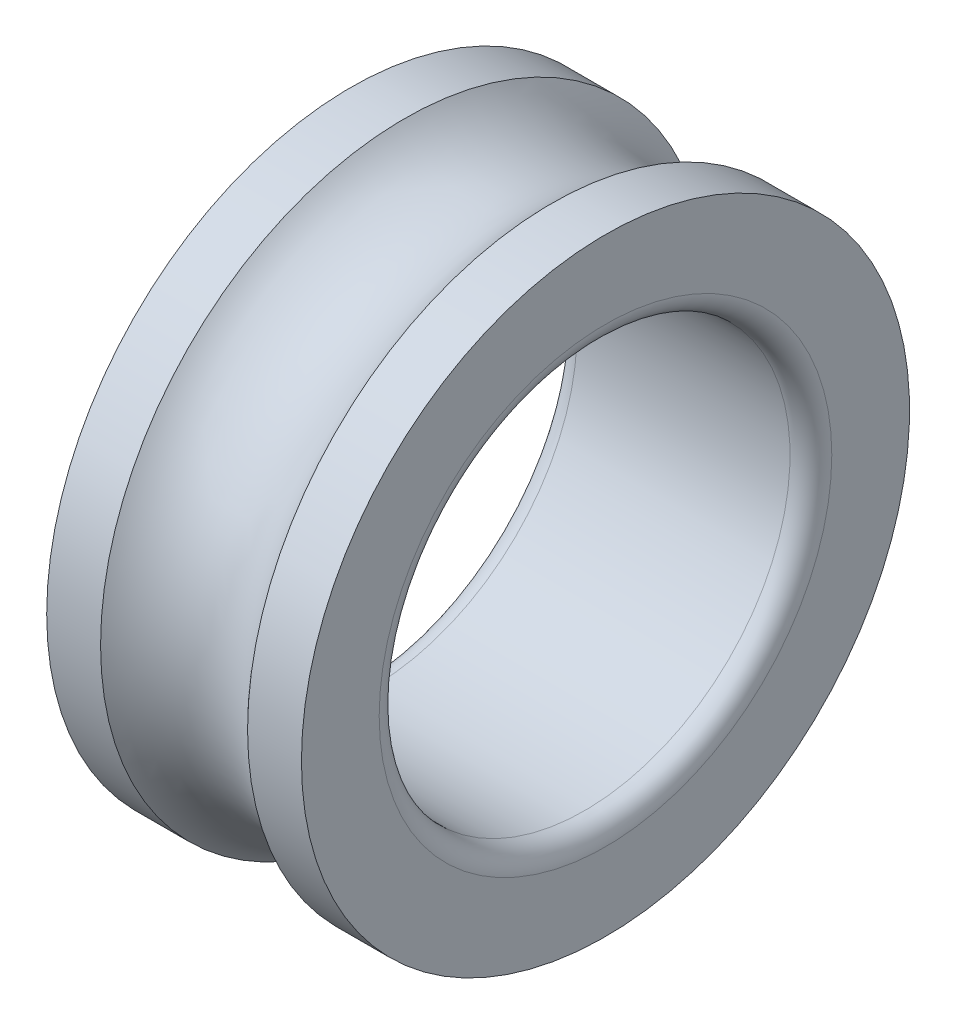
ISO-10303-21;
HEADER;
FILE_DESCRIPTION(('STEP AP214'),'2;1');
FILE_NAME('part.step','',(''),(''),'','','');
FILE_SCHEMA(('AUTOMOTIVE_DESIGN { 1 0 10303 214 1 1 1 1 }'));
ENDSEC;
DATA;
#1=APPLICATION_CONTEXT('core data for automotive mechanical design processes');
#2=APPLICATION_PROTOCOL_DEFINITION('international standard','automotive_design',2000,#1);
#3=PRODUCT_CONTEXT('',#1,'mechanical');
#4=PRODUCT('Part','Part','',(#3));
#5=PRODUCT_RELATED_PRODUCT_CATEGORY('part','',(#4));
#6=PRODUCT_DEFINITION_FORMATION('','',#4);
#7=PRODUCT_DEFINITION_CONTEXT('part definition',#1,'design');
#8=PRODUCT_DEFINITION('design','',#6,#7);
#9=PRODUCT_DEFINITION_SHAPE('','',#8);
#10=(LENGTH_UNIT() NAMED_UNIT(*) SI_UNIT(.MILLI.,.METRE.));
#11=(NAMED_UNIT(*) PLANE_ANGLE_UNIT() SI_UNIT($,.RADIAN.));
#12=(NAMED_UNIT(*) SI_UNIT($,.STERADIAN.) SOLID_ANGLE_UNIT());
#13=UNCERTAINTY_MEASURE_WITH_UNIT(LENGTH_MEASURE(1.E-05),#10,'distance_accuracy_value','');
#14=(GEOMETRIC_REPRESENTATION_CONTEXT(3) GLOBAL_UNCERTAINTY_ASSIGNED_CONTEXT((#13)) GLOBAL_UNIT_ASSIGNED_CONTEXT((#10,
#11,#12)) REPRESENTATION_CONTEXT('',''));
#15=CARTESIAN_POINT('',(0.,0.,0.));
#16=DIRECTION('',(0.,0.,1.));
#17=DIRECTION('',(1.,0.,0.));
#18=AXIS2_PLACEMENT_3D('',#15,#16,#17);
#19=CARTESIAN_POINT('',(-5.425,12.95,0.));
#20=DIRECTION('',(1.,0.,0.));
#21=DIRECTION('',(0.,0.,-1.));
#22=AXIS2_PLACEMENT_3D('',#19,#20,#21);
#23=PLANE('',#22);
#24=CARTESIAN_POINT('',(-5.425,0.,0.));
#25=DIRECTION('',(-1.,0.,0.));
#26=DIRECTION('',(0.,0.,1.));
#27=AXIS2_PLACEMENT_3D('',#24,#25,#26);
#28=CIRCLE('',#27,9.63900000000001);
#29=CARTESIAN_POINT('',(-5.425,0.,9.63900000000001));
#30=VERTEX_POINT('',#29);
#31=EDGE_CURVE('E10',#30,#30,#28,.T.);
#32=ORIENTED_EDGE('',*,*,#31,.F.);
#33=EDGE_LOOP('',(#32));
#34=FACE_BOUND('',#33,.T.);
#35=CARTESIAN_POINT('',(-5.425,0.,0.));
#36=DIRECTION('',(-1.,0.,0.));
#37=DIRECTION('',(0.,0.,1.));
#38=AXIS2_PLACEMENT_3D('',#35,#36,#37);
#39=CIRCLE('',#38,12.95);
#40=CARTESIAN_POINT('',(-5.425,0.,12.95));
#41=VERTEX_POINT('',#40);
#42=EDGE_CURVE('E63',#41,#41,#39,.T.);
#43=ORIENTED_EDGE('',*,*,#42,.T.);
#44=EDGE_LOOP('',(#43));
#45=FACE_BOUND('',#44,.T.);
#46=ADVANCED_FACE('F35',(#34,#45),#23,.F.);
#47=CARTESIAN_POINT('',(-4.536,0.,0.));
#48=DIRECTION('',(-1.,0.,0.));
#49=DIRECTION('',(0.,0.,1.));
#50=AXIS2_PLACEMENT_3D('',#47,#48,#49);
#51=TOROIDAL_SURFACE('',#50,9.639,0.889);
#52=CARTESIAN_POINT('',(-4.53599999999999,0.,0.));
#53=DIRECTION('',(-1.,0.,0.));
#54=DIRECTION('',(0.,0.,1.));
#55=AXIS2_PLACEMENT_3D('',#52,#53,#54);
#56=CIRCLE('',#55,8.75);
#57=CARTESIAN_POINT('',(-4.53599999999999,0.,8.75));
#58=VERTEX_POINT('',#57);
#59=EDGE_CURVE('E41',#58,#58,#56,.T.);
#60=ORIENTED_EDGE('',*,*,#59,.F.);
#61=EDGE_LOOP('',(#60));
#62=FACE_BOUND('',#61,.T.);
#63=ORIENTED_EDGE('',*,*,#31,.T.);
#64=EDGE_LOOP('',(#63));
#65=FACE_BOUND('',#64,.T.);
#66=ADVANCED_FACE('F100',(#62,#65),#51,.T.);
#67=CARTESIAN_POINT('',(-7.58333333333333,0.,0.));
#68=DIRECTION('',(-1.,0.,0.));
#69=DIRECTION('',(0.,0.,1.));
#70=AXIS2_PLACEMENT_3D('',#67,#68,#69);
#71=CYLINDRICAL_SURFACE('',#70,8.75);
#72=CARTESIAN_POINT('',(4.53599999999999,0.,0.));
#73=DIRECTION('',(-1.,0.,0.));
#74=DIRECTION('',(0.,0.,1.));
#75=AXIS2_PLACEMENT_3D('',#72,#73,#74);
#76=CIRCLE('',#75,8.75);
#77=CARTESIAN_POINT('',(4.53599999999999,0.,8.75));
#78=VERTEX_POINT('',#77);
#79=EDGE_CURVE('E45',#78,#78,#76,.T.);
#80=ORIENTED_EDGE('',*,*,#79,.F.);
#81=EDGE_LOOP('',(#80));
#82=FACE_BOUND('',#81,.T.);
#83=ORIENTED_EDGE('',*,*,#59,.T.);
#84=EDGE_LOOP('',(#83));
#85=FACE_BOUND('',#84,.T.);
#86=ADVANCED_FACE('F95',(#82,#85),#71,.F.);
#87=CARTESIAN_POINT('',(4.536,0.,0.));
#88=DIRECTION('',(-1.,0.,0.));
#89=DIRECTION('',(0.,0.,1.));
#90=AXIS2_PLACEMENT_3D('',#87,#88,#89);
#91=TOROIDAL_SURFACE('',#90,9.639,0.889);
#92=CARTESIAN_POINT('',(5.425,0.,0.));
#93=DIRECTION('',(-1.,0.,0.));
#94=DIRECTION('',(0.,0.,1.));
#95=AXIS2_PLACEMENT_3D('',#92,#93,#94);
#96=CIRCLE('',#95,9.63900000000001);
#97=CARTESIAN_POINT('',(5.425,0.,9.63900000000001));
#98=VERTEX_POINT('',#97);
#99=EDGE_CURVE('E49',#98,#98,#96,.T.);
#100=ORIENTED_EDGE('',*,*,#99,.F.);
#101=EDGE_LOOP('',(#100));
#102=FACE_BOUND('',#101,.T.);
#103=ORIENTED_EDGE('',*,*,#79,.T.);
#104=EDGE_LOOP('',(#103));
#105=FACE_BOUND('',#104,.T.);
#106=ADVANCED_FACE('F89',(#102,#105),#91,.T.);
#107=CARTESIAN_POINT('',(5.425,12.95,0.));
#108=DIRECTION('',(-1.,0.,0.));
#109=DIRECTION('',(0.,0.,1.));
#110=AXIS2_PLACEMENT_3D('',#107,#108,#109);
#111=PLANE('',#110);
#112=CARTESIAN_POINT('',(5.425,0.,0.));
#113=DIRECTION('',(-1.,0.,0.));
#114=DIRECTION('',(0.,0.,1.));
#115=AXIS2_PLACEMENT_3D('',#112,#113,#114);
#116=CIRCLE('',#115,12.95);
#117=CARTESIAN_POINT('',(5.425,0.,12.95));
#118=VERTEX_POINT('',#117);
#119=EDGE_CURVE('E54',#118,#118,#116,.T.);
#120=ORIENTED_EDGE('',*,*,#119,.F.);
#121=EDGE_LOOP('',(#120));
#122=FACE_BOUND('',#121,.T.);
#123=ORIENTED_EDGE('',*,*,#99,.T.);
#124=EDGE_LOOP('',(#123));
#125=FACE_BOUND('',#124,.T.);
#126=ADVANCED_FACE('F83',(#122,#125),#111,.F.);
#127=CARTESIAN_POINT('',(-7.58333333333333,0.,0.));
#128=DIRECTION('',(-1.,0.,0.));
#129=DIRECTION('',(0.,0.,1.));
#130=AXIS2_PLACEMENT_3D('',#127,#128,#129);
#131=CYLINDRICAL_SURFACE('',#130,12.95);
#132=CARTESIAN_POINT('',(3.13049516849971,0.,0.));
#133=DIRECTION('',(-1.,0.,0.));
#134=DIRECTION('',(0.,0.,1.));
#135=AXIS2_PLACEMENT_3D('',#132,#133,#134);
#136=CIRCLE('',#135,12.95);
#137=CARTESIAN_POINT('',(3.13049516849971,0.,12.95));
#138=VERTEX_POINT('',#137);
#139=EDGE_CURVE('E57',#138,#138,#136,.T.);
#140=ORIENTED_EDGE('',*,*,#139,.F.);
#141=EDGE_LOOP('',(#140));
#142=FACE_BOUND('',#141,.T.);
#143=ORIENTED_EDGE('',*,*,#119,.T.);
#144=EDGE_LOOP('',(#143));
#145=FACE_BOUND('',#144,.T.);
#146=ADVANCED_FACE('F77',(#142,#145),#131,.T.);
#147=CARTESIAN_POINT('',(0.,0.,0.));
#148=DIRECTION('',(-1.,0.,0.));
#149=DIRECTION('',(0.,0.,1.));
#150=AXIS2_PLACEMENT_3D('',#147,#148,#149);
#151=TOROIDAL_SURFACE('',#150,15.75,4.2);
#152=CARTESIAN_POINT('',(-3.13049516849971,0.,0.));
#153=DIRECTION('',(-1.,0.,0.));
#154=DIRECTION('',(0.,0.,1.));
#155=AXIS2_PLACEMENT_3D('',#152,#153,#154);
#156=CIRCLE('',#155,12.95);
#157=CARTESIAN_POINT('',(-3.13049516849971,0.,12.95));
#158=VERTEX_POINT('',#157);
#159=EDGE_CURVE('E60',#158,#158,#156,.T.);
#160=ORIENTED_EDGE('',*,*,#159,.F.);
#161=EDGE_LOOP('',(#160));
#162=FACE_BOUND('',#161,.T.);
#163=ORIENTED_EDGE('',*,*,#139,.T.);
#164=EDGE_LOOP('',(#163));
#165=FACE_BOUND('',#164,.T.);
#166=ADVANCED_FACE('F71',(#162,#165),#151,.F.);
#167=CARTESIAN_POINT('',(-7.58333333333333,0.,0.));
#168=DIRECTION('',(-1.,0.,0.));
#169=DIRECTION('',(0.,0.,1.));
#170=AXIS2_PLACEMENT_3D('',#167,#168,#169);
#171=CYLINDRICAL_SURFACE('',#170,12.95);
#172=ORIENTED_EDGE('',*,*,#42,.F.);
#173=EDGE_LOOP('',(#172));
#174=FACE_BOUND('',#173,.T.);
#175=ORIENTED_EDGE('',*,*,#159,.T.);
#176=EDGE_LOOP('',(#175));
#177=FACE_BOUND('',#176,.T.);
#178=ADVANCED_FACE('F68',(#174,#177),#171,.T.);
#179=CLOSED_SHELL('',(#46,#66,#86,#106,#126,#146,#166,#178));
#180=MANIFOLD_SOLID_BREP('B2',#179);
#181=ADVANCED_BREP_SHAPE_REPRESENTATION('',(#18,#180),#14);
#182=SHAPE_DEFINITION_REPRESENTATION(#9,#181);
ENDSEC;
END-ISO-10303-21;
